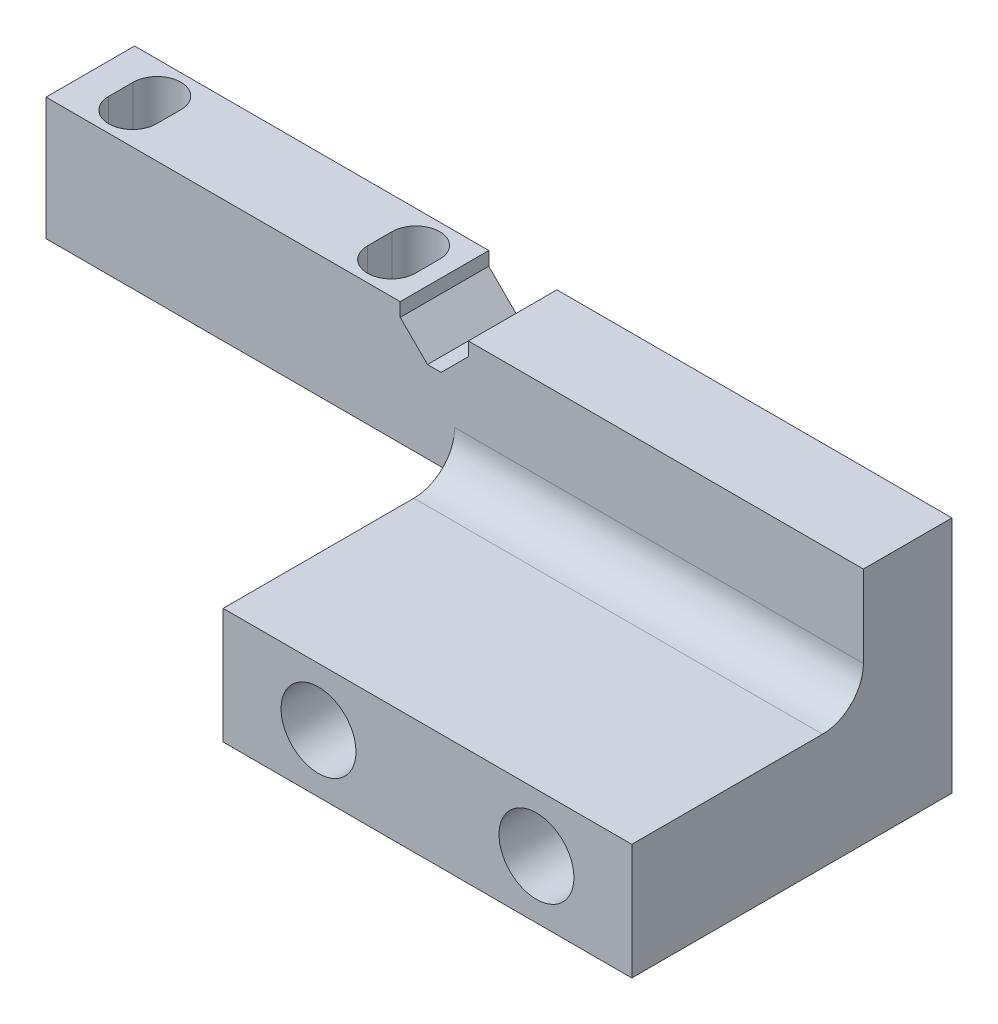
ISO-10303-21;
HEADER;
FILE_DESCRIPTION(('STEP AP214'),'2;1');
FILE_NAME('part.step','',(''),(''),'','','');
FILE_SCHEMA(('AUTOMOTIVE_DESIGN { 1 0 10303 214 1 1 1 1 }'));
ENDSEC;
DATA;
#1=APPLICATION_CONTEXT('core data for automotive mechanical design processes');
#2=APPLICATION_PROTOCOL_DEFINITION('international standard','automotive_design',2000,#1);
#3=PRODUCT_CONTEXT('',#1,'mechanical');
#4=PRODUCT('Part','Part','',(#3));
#5=PRODUCT_RELATED_PRODUCT_CATEGORY('part','',(#4));
#6=PRODUCT_DEFINITION_FORMATION('','',#4);
#7=PRODUCT_DEFINITION_CONTEXT('part definition',#1,'design');
#8=PRODUCT_DEFINITION('design','',#6,#7);
#9=PRODUCT_DEFINITION_SHAPE('','',#8);
#10=(LENGTH_UNIT() NAMED_UNIT(*) SI_UNIT(.MILLI.,.METRE.));
#11=(NAMED_UNIT(*) PLANE_ANGLE_UNIT() SI_UNIT($,.RADIAN.));
#12=(NAMED_UNIT(*) SI_UNIT($,.STERADIAN.) SOLID_ANGLE_UNIT());
#13=UNCERTAINTY_MEASURE_WITH_UNIT(LENGTH_MEASURE(1.E-05),#10,'distance_accuracy_value','');
#14=(GEOMETRIC_REPRESENTATION_CONTEXT(3) GLOBAL_UNCERTAINTY_ASSIGNED_CONTEXT((#13)) GLOBAL_UNIT_ASSIGNED_CONTEXT((#10,
#11,#12)) REPRESENTATION_CONTEXT('',''));
#15=CARTESIAN_POINT('',(0.,0.,0.));
#16=DIRECTION('',(0.,0.,1.));
#17=DIRECTION('',(1.,0.,0.));
#18=AXIS2_PLACEMENT_3D('',#15,#16,#17);
#19=CARTESIAN_POINT('',(-50.,13.25,0.));
#20=DIRECTION('',(0.,1.,0.));
#21=DIRECTION('',(1.,0.,0.));
#22=AXIS2_PLACEMENT_3D('',#19,#20,#21);
#23=PLANE('',#22);
#24=DIRECTION('',(0.,0.,-1.));
#25=VECTOR('',#24,1.);
#26=CARTESIAN_POINT('',(-69.,13.25,0.));
#27=LINE('',#26,#25);
#28=CARTESIAN_POINT('',(-69.,13.25,6.5));
#29=VERTEX_POINT('',#28);
#30=CARTESIAN_POINT('',(-69.,13.25,0.));
#31=VERTEX_POINT('',#30);
#32=EDGE_CURVE('E240',#29,#31,#27,.T.);
#33=ORIENTED_EDGE('',*,*,#32,.T.);
#34=DIRECTION('',(1.,0.,0.));
#35=VECTOR('',#34,1.);
#36=CARTESIAN_POINT('',(-5.,13.25,0.));
#37=LINE('',#36,#35);
#38=CARTESIAN_POINT('',(-95.,13.25,0.));
#39=VERTEX_POINT('',#38);
#40=EDGE_CURVE('E249',#39,#31,#37,.T.);
#41=ORIENTED_EDGE('',*,*,#40,.F.);
#42=DIRECTION('',(0.,0.,1.));
#43=VECTOR('',#42,1.);
#44=CARTESIAN_POINT('',(-95.,13.25,0.));
#45=LINE('',#44,#43);
#46=CARTESIAN_POINT('',(-95.,13.25,6.5));
#47=VERTEX_POINT('',#46);
#48=EDGE_CURVE('E382',#39,#47,#45,.T.);
#49=ORIENTED_EDGE('',*,*,#48,.T.);
#50=DIRECTION('',(-1.,0.,0.));
#51=VECTOR('',#50,1.);
#52=CARTESIAN_POINT('',(-5.,13.25,6.5));
#53=LINE('',#52,#51);
#54=EDGE_CURVE('E263',#29,#47,#53,.T.);
#55=ORIENTED_EDGE('',*,*,#54,.F.);
#56=EDGE_LOOP('',(#33,#41,#49,#55));
#57=FACE_BOUND('',#56,.T.);
#58=CARTESIAN_POINT('',(-72.,13.25,2.35));
#59=DIRECTION('',(0.,-1.,0.));
#60=DIRECTION('',(1.,0.,0.));
#61=AXIS2_PLACEMENT_3D('',#58,#59,#60);
#62=CIRCLE('',#61,1.75);
#63=CARTESIAN_POINT('',(-73.75,13.25,2.35));
#64=VERTEX_POINT('',#63);
#65=CARTESIAN_POINT('',(-70.25,13.25,2.35));
#66=VERTEX_POINT('',#65);
#67=EDGE_CURVE('E341',#64,#66,#62,.T.);
#68=ORIENTED_EDGE('',*,*,#67,.T.);
#69=DIRECTION('',(0.,0.,1.));
#70=VECTOR('',#69,1.);
#71=CARTESIAN_POINT('',(-70.25,13.25,2.35));
#72=LINE('',#71,#70);
#73=CARTESIAN_POINT('',(-70.25,13.25,4.15));
#74=VERTEX_POINT('',#73);
#75=EDGE_CURVE('E344',#66,#74,#72,.T.);
#76=ORIENTED_EDGE('',*,*,#75,.T.);
#77=CARTESIAN_POINT('',(-72.,13.25,4.15));
#78=DIRECTION('',(0.,-1.,0.));
#79=DIRECTION('',(1.,0.,0.));
#80=AXIS2_PLACEMENT_3D('',#77,#78,#79);
#81=CIRCLE('',#80,1.75);
#82=CARTESIAN_POINT('',(-73.75,13.25,4.15));
#83=VERTEX_POINT('',#82);
#84=EDGE_CURVE('E347',#74,#83,#81,.T.);
#85=ORIENTED_EDGE('',*,*,#84,.T.);
#86=DIRECTION('',(0.,0.,-1.));
#87=VECTOR('',#86,1.);
#88=CARTESIAN_POINT('',(-73.75,13.25,2.35));
#89=LINE('',#88,#87);
#90=EDGE_CURVE('E350',#83,#64,#89,.T.);
#91=ORIENTED_EDGE('',*,*,#90,.T.);
#92=EDGE_LOOP('',(#68,#76,#85,#91));
#93=FACE_BOUND('',#92,.T.);
#94=DIRECTION('',(0.,0.,-1.));
#95=VECTOR('',#94,1.);
#96=CARTESIAN_POINT('',(-89.25,13.25,2.35));
#97=LINE('',#96,#95);
#98=CARTESIAN_POINT('',(-89.25,13.25,4.15));
#99=VERTEX_POINT('',#98);
#100=CARTESIAN_POINT('',(-89.25,13.25,2.35));
#101=VERTEX_POINT('',#100);
#102=EDGE_CURVE('E364',#99,#101,#97,.T.);
#103=ORIENTED_EDGE('',*,*,#102,.F.);
#104=CARTESIAN_POINT('',(-91.,13.25,4.15));
#105=DIRECTION('',(0.,1.,0.));
#106=DIRECTION('',(-1.,0.,0.));
#107=AXIS2_PLACEMENT_3D('',#104,#105,#106);
#108=CIRCLE('',#107,1.75);
#109=CARTESIAN_POINT('',(-92.75,13.25,4.15));
#110=VERTEX_POINT('',#109);
#111=EDGE_CURVE('E367',#110,#99,#108,.T.);
#112=ORIENTED_EDGE('',*,*,#111,.F.);
#113=DIRECTION('',(0.,0.,1.));
#114=VECTOR('',#113,1.);
#115=CARTESIAN_POINT('',(-92.75,13.25,2.35));
#116=LINE('',#115,#114);
#117=CARTESIAN_POINT('',(-92.75,13.25,2.35));
#118=VERTEX_POINT('',#117);
#119=EDGE_CURVE('E370',#118,#110,#116,.T.);
#120=ORIENTED_EDGE('',*,*,#119,.F.);
#121=CARTESIAN_POINT('',(-91.,13.25,2.35));
#122=DIRECTION('',(0.,1.,0.));
#123=DIRECTION('',(-1.,0.,0.));
#124=AXIS2_PLACEMENT_3D('',#121,#122,#123);
#125=CIRCLE('',#124,1.75);
#126=EDGE_CURVE('E356',#101,#118,#125,.T.);
#127=ORIENTED_EDGE('',*,*,#126,.F.);
#128=EDGE_LOOP('',(#103,#112,#120,#127));
#129=FACE_BOUND('',#128,.T.);
#130=ADVANCED_FACE('F35',(#57,#93,#129),#23,.T.);
#131=CARTESIAN_POINT('',(-58.,0.,4.));
#132=DIRECTION('',(0.,0.,-1.));
#133=DIRECTION('',(1.,0.,0.));
#134=AXIS2_PLACEMENT_3D('',#131,#132,#133);
#135=CYLINDRICAL_SURFACE('',#134,4.5);
#136=CARTESIAN_POINT('',(-58.,0.,0.));
#137=DIRECTION('',(0.,0.,1.));
#138=DIRECTION('',(1.,0.,0.));
#139=AXIS2_PLACEMENT_3D('',#136,#137,#138);
#140=CIRCLE('',#139,4.5);
#141=CARTESIAN_POINT('',(-53.5,0.,0.));
#142=VERTEX_POINT('',#141);
#143=CARTESIAN_POINT('',(-62.5,0.,0.));
#144=VERTEX_POINT('',#143);
#145=EDGE_CURVE('E321',#142,#144,#140,.T.);
#146=ORIENTED_EDGE('',*,*,#145,.F.);
#147=DIRECTION('',(0.,0.,-1.));
#148=VECTOR('',#147,1.);
#149=CARTESIAN_POINT('',(-53.5,0.,4.));
#150=LINE('',#149,#148);
#151=CARTESIAN_POINT('',(-53.5,0.,4.));
#152=VERTEX_POINT('',#151);
#153=EDGE_CURVE('E292',#152,#142,#150,.T.);
#154=ORIENTED_EDGE('',*,*,#153,.F.);
#155=CARTESIAN_POINT('',(-58.,0.,4.));
#156=DIRECTION('',(0.,0.,1.));
#157=DIRECTION('',(1.,0.,0.));
#158=AXIS2_PLACEMENT_3D('',#155,#156,#157);
#159=CIRCLE('',#158,4.5);
#160=CARTESIAN_POINT('',(-62.5,0.,4.));
#161=VERTEX_POINT('',#160);
#162=EDGE_CURVE('E317',#152,#161,#159,.T.);
#163=ORIENTED_EDGE('',*,*,#162,.T.);
#164=DIRECTION('',(0.,0.,-1.));
#165=VECTOR('',#164,1.);
#166=CARTESIAN_POINT('',(-62.5,0.,4.));
#167=LINE('',#166,#165);
#168=EDGE_CURVE('E288',#161,#144,#167,.T.);
#169=ORIENTED_EDGE('',*,*,#168,.T.);
#170=EDGE_LOOP('',(#146,#154,#163,#169));
#171=FACE_BOUND('',#170,.T.);
#172=ADVANCED_FACE('F557',(#171),#135,.F.);
#173=CARTESIAN_POINT('',(-58.,0.,25.));
#174=DIRECTION('',(0.,0.,1.));
#175=DIRECTION('',(-1.,0.,0.));
#176=AXIS2_PLACEMENT_3D('',#173,#174,#175);
#177=CYLINDRICAL_SURFACE('',#176,2.74999999999999);
#178=CARTESIAN_POINT('',(-58.,0.,23.5));
#179=DIRECTION('',(0.,0.,1.));
#180=DIRECTION('',(1.,0.,0.));
#181=AXIS2_PLACEMENT_3D('',#178,#179,#180);
#182=CIRCLE('',#181,2.74999999999999);
#183=CARTESIAN_POINT('',(-55.25,0.,23.5));
#184=VERTEX_POINT('',#183);
#185=EDGE_CURVE('E409',#184,#184,#182,.F.);
#186=ORIENTED_EDGE('',*,*,#185,.F.);
#187=EDGE_LOOP('',(#186));
#188=FACE_BOUND('',#187,.T.);
#189=CARTESIAN_POINT('',(-58.,0.,4.));
#190=DIRECTION('',(0.,0.,1.));
#191=DIRECTION('',(1.,0.,0.));
#192=AXIS2_PLACEMENT_3D('',#189,#190,#191);
#193=CIRCLE('',#192,2.74999999999999);
#194=CARTESIAN_POINT('',(-55.25,0.,4.));
#195=VERTEX_POINT('',#194);
#196=EDGE_CURVE('E332',#195,#195,#193,.F.);
#197=ORIENTED_EDGE('',*,*,#196,.T.);
#198=EDGE_LOOP('',(#197));
#199=FACE_BOUND('',#198,.T.);
#200=ADVANCED_FACE('F585',(#188,#199),#177,.F.);
#201=CARTESIAN_POINT('',(-42.,0.,25.));
#202=DIRECTION('',(0.,0.,1.));
#203=DIRECTION('',(-1.,0.,0.));
#204=AXIS2_PLACEMENT_3D('',#201,#202,#203);
#205=CYLINDRICAL_SURFACE('',#204,2.74999999999999);
#206=CARTESIAN_POINT('',(-42.,0.,23.5));
#207=DIRECTION('',(0.,0.,1.));
#208=DIRECTION('',(1.,0.,0.));
#209=AXIS2_PLACEMENT_3D('',#206,#207,#208);
#210=CIRCLE('',#209,2.74999999999999);
#211=CARTESIAN_POINT('',(-39.25,0.,23.5));
#212=VERTEX_POINT('',#211);
#213=EDGE_CURVE('E406',#212,#212,#210,.F.);
#214=ORIENTED_EDGE('',*,*,#213,.F.);
#215=EDGE_LOOP('',(#214));
#216=FACE_BOUND('',#215,.T.);
#217=CARTESIAN_POINT('',(-42.,0.,4.));
#218=DIRECTION('',(0.,0.,1.));
#219=DIRECTION('',(1.,0.,0.));
#220=AXIS2_PLACEMENT_3D('',#217,#218,#219);
#221=CIRCLE('',#220,2.74999999999999);
#222=CARTESIAN_POINT('',(-39.25,0.,4.));
#223=VERTEX_POINT('',#222);
#224=EDGE_CURVE('E320',#223,#223,#221,.F.);
#225=ORIENTED_EDGE('',*,*,#224,.T.);
#226=EDGE_LOOP('',(#225));
#227=FACE_BOUND('',#226,.T.);
#228=ADVANCED_FACE('F590',(#216,#227),#205,.F.);
#229=DIRECTION('',(0.,0.,1.));
#230=VECTOR('',#229,1.);
#231=CARTESIAN_POINT('',(-64.,13.25,0.));
#232=LINE('',#231,#230);
#233=CARTESIAN_POINT('',(-64.,13.25,0.));
#234=VERTEX_POINT('',#233);
#235=CARTESIAN_POINT('',(-64.,13.25,6.5));
#236=VERTEX_POINT('',#235);
#237=EDGE_CURVE('E264',#234,#236,#232,.T.);
#238=ORIENTED_EDGE('',*,*,#237,.T.);
#239=CARTESIAN_POINT('',(-35.,13.25,6.5));
#240=VERTEX_POINT('',#239);
#241=EDGE_CURVE('E414',#240,#236,#53,.T.);
#242=ORIENTED_EDGE('',*,*,#241,.F.);
#243=DIRECTION('',(0.,0.,1.));
#244=VECTOR('',#243,1.);
#245=CARTESIAN_POINT('',(-35.,13.25,-3.5));
#246=LINE('',#245,#244);
#247=CARTESIAN_POINT('',(-35.,13.25,0.));
#248=VERTEX_POINT('',#247);
#249=EDGE_CURVE('E338',#248,#240,#246,.T.);
#250=ORIENTED_EDGE('',*,*,#249,.F.);
#251=EDGE_CURVE('E258',#234,#248,#37,.T.);
#252=ORIENTED_EDGE('',*,*,#251,.F.);
#253=EDGE_LOOP('',(#238,#242,#250,#252));
#254=FACE_BOUND('',#253,.T.);
#255=ADVANCED_FACE('F500',(#254),#23,.T.);
#256=CARTESIAN_POINT('',(-50.,4.25000000000001,0.));
#257=DIRECTION('',(0.,1.,0.));
#258=DIRECTION('',(-1.,0.,0.));
#259=AXIS2_PLACEMENT_3D('',#256,#257,#258);
#260=PLANE('',#259);
#261=DIRECTION('',(0.,0.,-1.));
#262=VECTOR('',#261,1.);
#263=CARTESIAN_POINT('',(-73.75,4.25000000000002,0.));
#264=LINE('',#263,#262);
#265=CARTESIAN_POINT('',(-73.75,4.25000000000002,4.15));
#266=VERTEX_POINT('',#265);
#267=CARTESIAN_POINT('',(-73.75,4.25000000000002,2.35));
#268=VERTEX_POINT('',#267);
#269=EDGE_CURVE('E468',#266,#268,#264,.T.);
#270=ORIENTED_EDGE('',*,*,#269,.F.);
#271=CARTESIAN_POINT('',(-72.,4.25000000000002,4.15));
#272=DIRECTION('',(0.,-1.,0.));
#273=DIRECTION('',(1.,0.,0.));
#274=AXIS2_PLACEMENT_3D('',#271,#272,#273);
#275=CIRCLE('',#274,1.75);
#276=CARTESIAN_POINT('',(-70.25,4.25000000000002,4.15));
#277=VERTEX_POINT('',#276);
#278=EDGE_CURVE('E465',#277,#266,#275,.T.);
#279=ORIENTED_EDGE('',*,*,#278,.F.);
#280=DIRECTION('',(0.,0.,1.));
#281=VECTOR('',#280,1.);
#282=CARTESIAN_POINT('',(-70.25,4.25000000000002,0.));
#283=LINE('',#282,#281);
#284=CARTESIAN_POINT('',(-70.25,4.25000000000002,2.35));
#285=VERTEX_POINT('',#284);
#286=EDGE_CURVE('E462',#285,#277,#283,.T.);
#287=ORIENTED_EDGE('',*,*,#286,.F.);
#288=CARTESIAN_POINT('',(-72.,4.25000000000002,2.35));
#289=DIRECTION('',(0.,-1.,0.));
#290=DIRECTION('',(1.,0.,0.));
#291=AXIS2_PLACEMENT_3D('',#288,#289,#290);
#292=CIRCLE('',#291,1.75);
#293=EDGE_CURVE('E471',#268,#285,#292,.T.);
#294=ORIENTED_EDGE('',*,*,#293,.F.);
#295=EDGE_LOOP('',(#270,#279,#287,#294));
#296=FACE_BOUND('',#295,.T.);
#297=DIRECTION('',(1.,0.,0.));
#298=VECTOR('',#297,1.);
#299=CARTESIAN_POINT('',(-95.,4.25000000000003,6.5));
#300=LINE('',#299,#298);
#301=CARTESIAN_POINT('',(-95.,4.25000000000003,6.5));
#302=VERTEX_POINT('',#301);
#303=CARTESIAN_POINT('',(-65.,4.25000000000002,6.5));
#304=VERTEX_POINT('',#303);
#305=EDGE_CURVE('E385',#302,#304,#300,.T.);
#306=ORIENTED_EDGE('',*,*,#305,.F.);
#307=DIRECTION('',(0.,0.,1.));
#308=VECTOR('',#307,1.);
#309=CARTESIAN_POINT('',(-95.,4.25000000000003,0.));
#310=LINE('',#309,#308);
#311=CARTESIAN_POINT('',(-95.,4.25000000000003,0.));
#312=VERTEX_POINT('',#311);
#313=EDGE_CURVE('E376',#312,#302,#310,.T.);
#314=ORIENTED_EDGE('',*,*,#313,.F.);
#315=DIRECTION('',(-1.,0.,0.));
#316=VECTOR('',#315,1.);
#317=CARTESIAN_POINT('',(-95.,4.25000000000003,0.));
#318=LINE('',#317,#316);
#319=CARTESIAN_POINT('',(-65.,4.25000000000002,0.));
#320=VERTEX_POINT('',#319);
#321=EDGE_CURVE('E388',#320,#312,#318,.T.);
#322=ORIENTED_EDGE('',*,*,#321,.F.);
#323=DIRECTION('',(0.,0.,-1.));
#324=VECTOR('',#323,1.);
#325=CARTESIAN_POINT('',(-65.,4.25000000000002,25.));
#326=LINE('',#325,#324);
#327=EDGE_CURVE('E397',#304,#320,#326,.T.);
#328=ORIENTED_EDGE('',*,*,#327,.F.);
#329=EDGE_LOOP('',(#306,#314,#322,#328));
#330=FACE_BOUND('',#329,.T.);
#331=CARTESIAN_POINT('',(-91.,4.25000000000003,2.35));
#332=DIRECTION('',(0.,-1.,0.));
#333=DIRECTION('',(1.,0.,0.));
#334=AXIS2_PLACEMENT_3D('',#331,#332,#333);
#335=CIRCLE('',#334,1.75);
#336=CARTESIAN_POINT('',(-89.25,4.25000000000003,2.35));
#337=VERTEX_POINT('',#336);
#338=CARTESIAN_POINT('',(-92.75,4.25000000000003,2.35));
#339=VERTEX_POINT('',#338);
#340=EDGE_CURVE('E459',#337,#339,#335,.F.);
#341=ORIENTED_EDGE('',*,*,#340,.T.);
#342=DIRECTION('',(0.,0.,1.));
#343=VECTOR('',#342,1.);
#344=CARTESIAN_POINT('',(-92.75,4.25000000000003,0.));
#345=LINE('',#344,#343);
#346=CARTESIAN_POINT('',(-92.75,4.25000000000003,4.15));
#347=VERTEX_POINT('',#346);
#348=EDGE_CURVE('E456',#339,#347,#345,.T.);
#349=ORIENTED_EDGE('',*,*,#348,.T.);
#350=CARTESIAN_POINT('',(-91.,4.25000000000003,4.15));
#351=DIRECTION('',(0.,-1.,0.));
#352=DIRECTION('',(1.,0.,0.));
#353=AXIS2_PLACEMENT_3D('',#350,#351,#352);
#354=CIRCLE('',#353,1.75);
#355=CARTESIAN_POINT('',(-89.25,4.25000000000003,4.15));
#356=VERTEX_POINT('',#355);
#357=EDGE_CURVE('E453',#347,#356,#354,.F.);
#358=ORIENTED_EDGE('',*,*,#357,.T.);
#359=DIRECTION('',(0.,0.,-1.));
#360=VECTOR('',#359,1.);
#361=CARTESIAN_POINT('',(-89.25,4.25000000000003,0.));
#362=LINE('',#361,#360);
#363=EDGE_CURVE('E448',#356,#337,#362,.T.);
#364=ORIENTED_EDGE('',*,*,#363,.T.);
#365=EDGE_LOOP('',(#341,#349,#358,#364));
#366=FACE_BOUND('',#365,.T.);
#367=ADVANCED_FACE('F516',(#296,#330,#366),#260,.F.);
#368=CARTESIAN_POINT('',(-65.,4.25000000000002,25.));
#369=DIRECTION('',(0.,-1.,0.));
#370=DIRECTION('',(-1.,0.,0.));
#371=AXIS2_PLACEMENT_3D('',#368,#369,#370);
#372=PLANE('',#371);
#373=DIRECTION('',(0.,0.,-1.));
#374=VECTOR('',#373,1.);
#375=CARTESIAN_POINT('',(-35.,4.25,25.));
#376=LINE('',#375,#374);
#377=CARTESIAN_POINT('',(-35.,4.25000000000001,23.5));
#378=VERTEX_POINT('',#377);
#379=CARTESIAN_POINT('',(-35.,4.25,9.5));
#380=VERTEX_POINT('',#379);
#381=EDGE_CURVE('E426',#378,#380,#376,.T.);
#382=ORIENTED_EDGE('',*,*,#381,.T.);
#383=DIRECTION('',(-1.,0.,0.));
#384=VECTOR('',#383,1.);
#385=CARTESIAN_POINT('',(-35.,4.25,9.5));
#386=LINE('',#385,#384);
#387=CARTESIAN_POINT('',(-65.,4.25000000000002,9.5));
#388=VERTEX_POINT('',#387);
#389=EDGE_CURVE('E440',#388,#380,#386,.F.);
#390=ORIENTED_EDGE('',*,*,#389,.F.);
#391=DIRECTION('',(0.,0.,-1.));
#392=VECTOR('',#391,1.);
#393=CARTESIAN_POINT('',(-65.,4.25000000000002,25.));
#394=LINE('',#393,#392);
#395=CARTESIAN_POINT('',(-65.,4.25000000000002,23.5));
#396=VERTEX_POINT('',#395);
#397=EDGE_CURVE('E429',#396,#388,#394,.T.);
#398=ORIENTED_EDGE('',*,*,#397,.F.);
#399=DIRECTION('',(-1.,0.,0.));
#400=VECTOR('',#399,1.);
#401=CARTESIAN_POINT('',(-5.00000000000001,4.24999999999999,23.5));
#402=LINE('',#401,#400);
#403=EDGE_CURVE('E403',#378,#396,#402,.T.);
#404=ORIENTED_EDGE('',*,*,#403,.F.);
#405=EDGE_LOOP('',(#382,#390,#398,#404));
#406=FACE_BOUND('',#405,.T.);
#407=ADVANCED_FACE('F568',(#406),#372,.F.);
#408=CARTESIAN_POINT('',(-35.,-4.25,25.));
#409=DIRECTION('',(-1.,0.,0.));
#410=DIRECTION('',(0.,1.,0.));
#411=AXIS2_PLACEMENT_3D('',#408,#409,#410);
#412=PLANE('',#411);
#413=ORIENTED_EDGE('',*,*,#249,.T.);
#414=DIRECTION('',(0.,1.,0.));
#415=VECTOR('',#414,1.);
#416=CARTESIAN_POINT('',(-35.,4.25000000000001,6.5));
#417=LINE('',#416,#415);
#418=CARTESIAN_POINT('',(-35.,7.25,6.5));
#419=VERTEX_POINT('',#418);
#420=EDGE_CURVE('E336',#419,#240,#417,.T.);
#421=ORIENTED_EDGE('',*,*,#420,.F.);
#422=CARTESIAN_POINT('',(-35.,7.25,9.5));
#423=DIRECTION('',(1.,0.,0.));
#424=DIRECTION('',(0.,1.,0.));
#425=AXIS2_PLACEMENT_3D('',#422,#423,#424);
#426=CIRCLE('',#425,3.);
#427=EDGE_CURVE('E445',#380,#419,#426,.T.);
#428=ORIENTED_EDGE('',*,*,#427,.F.);
#429=ORIENTED_EDGE('',*,*,#381,.F.);
#430=DIRECTION('',(0.,1.,0.));
#431=VECTOR('',#430,1.);
#432=CARTESIAN_POINT('',(-35.,-4.25,23.5));
#433=LINE('',#432,#431);
#434=CARTESIAN_POINT('',(-35.,-4.24999999999999,23.5));
#435=VERTEX_POINT('',#434);
#436=EDGE_CURVE('E412',#435,#378,#433,.T.);
#437=ORIENTED_EDGE('',*,*,#436,.F.);
#438=DIRECTION('',(0.,0.,-1.));
#439=VECTOR('',#438,1.);
#440=CARTESIAN_POINT('',(-35.,-4.25,25.));
#441=LINE('',#440,#439);
#442=CARTESIAN_POINT('',(-35.,-4.25,0.));
#443=VERTEX_POINT('',#442);
#444=EDGE_CURVE('E435',#435,#443,#441,.T.);
#445=ORIENTED_EDGE('',*,*,#444,.T.);
#446=DIRECTION('',(0.,-1.,0.));
#447=VECTOR('',#446,1.);
#448=CARTESIAN_POINT('',(-35.,-4.25,0.));
#449=LINE('',#448,#447);
#450=EDGE_CURVE('E257',#248,#443,#449,.T.);
#451=ORIENTED_EDGE('',*,*,#450,.F.);
#452=EDGE_LOOP('',(#413,#421,#428,#429,#437,#445,#451));
#453=FACE_BOUND('',#452,.T.);
#454=ADVANCED_FACE('F528',(#453),#412,.F.);
#455=CARTESIAN_POINT('',(-65.,-4.24999999999998,25.));
#456=DIRECTION('',(0.,1.,0.));
#457=DIRECTION('',(1.,0.,0.));
#458=AXIS2_PLACEMENT_3D('',#455,#456,#457);
#459=PLANE('',#458);
#460=DIRECTION('',(1.,0.,0.));
#461=VECTOR('',#460,1.);
#462=CARTESIAN_POINT('',(-65.,-4.24999999999998,4.));
#463=LINE('',#462,#461);
#464=CARTESIAN_POINT('',(-62.5,-4.24999999999998,4.));
#465=VERTEX_POINT('',#464);
#466=CARTESIAN_POINT('',(-53.5,-4.24999999999999,4.));
#467=VERTEX_POINT('',#466);
#468=EDGE_CURVE('E333',#465,#467,#463,.T.);
#469=ORIENTED_EDGE('',*,*,#468,.T.);
#470=DIRECTION('',(0.,0.,-1.));
#471=VECTOR('',#470,1.);
#472=CARTESIAN_POINT('',(-53.5,-4.24999999999999,4.));
#473=LINE('',#472,#471);
#474=CARTESIAN_POINT('',(-53.5,-4.24999999999999,0.));
#475=VERTEX_POINT('',#474);
#476=EDGE_CURVE('E295',#467,#475,#473,.T.);
#477=ORIENTED_EDGE('',*,*,#476,.T.);
#478=DIRECTION('',(-1.,0.,0.));
#479=VECTOR('',#478,1.);
#480=CARTESIAN_POINT('',(-65.,-4.24999999999998,0.));
#481=LINE('',#480,#479);
#482=CARTESIAN_POINT('',(-46.5,-4.24999999999999,0.));
#483=VERTEX_POINT('',#482);
#484=EDGE_CURVE('E424',#483,#475,#481,.T.);
#485=ORIENTED_EDGE('',*,*,#484,.F.);
#486=DIRECTION('',(0.,0.,-1.));
#487=VECTOR('',#486,1.);
#488=CARTESIAN_POINT('',(-46.5,-4.24999999999999,4.));
#489=LINE('',#488,#487);
#490=CARTESIAN_POINT('',(-46.5,-4.24999999999999,4.));
#491=VERTEX_POINT('',#490);
#492=EDGE_CURVE('E311',#491,#483,#489,.T.);
#493=ORIENTED_EDGE('',*,*,#492,.F.);
#494=DIRECTION('',(1.,0.,0.));
#495=VECTOR('',#494,1.);
#496=CARTESIAN_POINT('',(-65.,-4.24999999999998,4.));
#497=LINE('',#496,#495);
#498=CARTESIAN_POINT('',(-37.5,-4.24999999999999,4.));
#499=VERTEX_POINT('',#498);
#500=EDGE_CURVE('E329',#491,#499,#497,.T.);
#501=ORIENTED_EDGE('',*,*,#500,.T.);
#502=DIRECTION('',(0.,0.,-1.));
#503=VECTOR('',#502,1.);
#504=CARTESIAN_POINT('',(-37.5,-4.24999999999999,4.));
#505=LINE('',#504,#503);
#506=CARTESIAN_POINT('',(-37.5,-4.24999999999999,0.));
#507=VERTEX_POINT('',#506);
#508=EDGE_CURVE('E286',#499,#507,#505,.T.);
#509=ORIENTED_EDGE('',*,*,#508,.T.);
#510=EDGE_CURVE('E420',#443,#507,#481,.T.);
#511=ORIENTED_EDGE('',*,*,#510,.F.);
#512=ORIENTED_EDGE('',*,*,#444,.F.);
#513=DIRECTION('',(-1.,0.,0.));
#514=VECTOR('',#513,1.);
#515=CARTESIAN_POINT('',(-5.00000000000001,-4.25000000000001,23.5));
#516=LINE('',#515,#514);
#517=CARTESIAN_POINT('',(-65.,-4.24999999999998,23.5));
#518=VERTEX_POINT('',#517);
#519=EDGE_CURVE('E402',#435,#518,#516,.T.);
#520=ORIENTED_EDGE('',*,*,#519,.T.);
#521=DIRECTION('',(0.,0.,-1.));
#522=VECTOR('',#521,1.);
#523=CARTESIAN_POINT('',(-65.,-4.24999999999998,25.));
#524=LINE('',#523,#522);
#525=CARTESIAN_POINT('',(-65.,-4.24999999999998,0.));
#526=VERTEX_POINT('',#525);
#527=EDGE_CURVE('E432',#518,#526,#524,.T.);
#528=ORIENTED_EDGE('',*,*,#527,.T.);
#529=CARTESIAN_POINT('',(-62.5,-4.24999999999998,0.));
#530=VERTEX_POINT('',#529);
#531=EDGE_CURVE('E419',#530,#526,#481,.T.);
#532=ORIENTED_EDGE('',*,*,#531,.F.);
#533=DIRECTION('',(0.,0.,-1.));
#534=VECTOR('',#533,1.);
#535=CARTESIAN_POINT('',(-62.5,-4.24999999999998,4.));
#536=LINE('',#535,#534);
#537=EDGE_CURVE('E283',#465,#530,#536,.T.);
#538=ORIENTED_EDGE('',*,*,#537,.F.);
#539=EDGE_LOOP('',(#469,#477,#485,#493,#501,#509,#511,#512,#520,#528,#532,#538));
#540=FACE_BOUND('',#539,.T.);
#541=ADVANCED_FACE('F532',(#540),#459,.F.);
#542=CARTESIAN_POINT('',(-65.,-4.24999999999998,25.));
#543=DIRECTION('',(1.,0.,0.));
#544=DIRECTION('',(0.,0.,1.));
#545=AXIS2_PLACEMENT_3D('',#542,#543,#544);
#546=PLANE('',#545);
#547=ORIENTED_EDGE('',*,*,#327,.T.);
#548=DIRECTION('',(0.,1.,0.));
#549=VECTOR('',#548,1.);
#550=CARTESIAN_POINT('',(-65.,-4.24999999999998,0.));
#551=LINE('',#550,#549);
#552=EDGE_CURVE('E423',#526,#320,#551,.T.);
#553=ORIENTED_EDGE('',*,*,#552,.F.);
#554=ORIENTED_EDGE('',*,*,#527,.F.);
#555=DIRECTION('',(0.,1.,0.));
#556=VECTOR('',#555,1.);
#557=CARTESIAN_POINT('',(-65.,4.25000000000002,23.5));
#558=LINE('',#557,#556);
#559=EDGE_CURVE('E400',#518,#396,#558,.T.);
#560=ORIENTED_EDGE('',*,*,#559,.T.);
#561=ORIENTED_EDGE('',*,*,#397,.T.);
#562=CARTESIAN_POINT('',(-65.,7.25000000000002,9.5));
#563=DIRECTION('',(-1.,0.,0.));
#564=DIRECTION('',(0.,0.,1.));
#565=AXIS2_PLACEMENT_3D('',#562,#563,#564);
#566=CIRCLE('',#565,3.);
#567=CARTESIAN_POINT('',(-65.,7.25000000000002,6.5));
#568=VERTEX_POINT('',#567);
#569=EDGE_CURVE('E443',#568,#388,#566,.T.);
#570=ORIENTED_EDGE('',*,*,#569,.F.);
#571=DIRECTION('',(0.,1.,0.));
#572=VECTOR('',#571,1.);
#573=CARTESIAN_POINT('',(-65.,-4.24999999999998,6.5));
#574=LINE('',#573,#572);
#575=EDGE_CURVE('E394',#304,#568,#574,.T.);
#576=ORIENTED_EDGE('',*,*,#575,.F.);
#577=EDGE_LOOP('',(#547,#553,#554,#560,#561,#570,#576));
#578=FACE_BOUND('',#577,.T.);
#579=ADVANCED_FACE('F520',(#578),#546,.F.);
#580=CARTESIAN_POINT('',(-50.,0.,0.));
#581=DIRECTION('',(0.,0.,1.));
#582=DIRECTION('',(-1.,0.,0.));
#583=AXIS2_PLACEMENT_3D('',#580,#581,#582);
#584=PLANE('',#583);
#585=DIRECTION('',(1.,0.,0.));
#586=VECTOR('',#585,1.);
#587=CARTESIAN_POINT('',(-69.,10.25,0.));
#588=LINE('',#587,#586);
#589=CARTESIAN_POINT('',(-67.,10.25,0.));
#590=VERTEX_POINT('',#589);
#591=CARTESIAN_POINT('',(-66.,10.25,0.));
#592=VERTEX_POINT('',#591);
#593=EDGE_CURVE('E267',#590,#592,#588,.T.);
#594=ORIENTED_EDGE('',*,*,#593,.T.);
#595=DIRECTION('',(0.707106781186552,0.707106781186543,0.));
#596=VECTOR('',#595,1.);
#597=CARTESIAN_POINT('',(-63.1249999999999,13.1250000000001,0.));
#598=LINE('',#597,#596);
#599=CARTESIAN_POINT('',(-64.,12.25,0.));
#600=VERTEX_POINT('',#599);
#601=EDGE_CURVE('E11',#600,#592,#598,.F.);
#602=ORIENTED_EDGE('',*,*,#601,.F.);
#603=DIRECTION('',(0.,1.,0.));
#604=VECTOR('',#603,1.);
#605=CARTESIAN_POINT('',(-64.,10.25,0.));
#606=LINE('',#605,#604);
#607=EDGE_CURVE('E245',#600,#234,#606,.T.);
#608=ORIENTED_EDGE('',*,*,#607,.T.);
#609=ORIENTED_EDGE('',*,*,#251,.T.);
#610=ORIENTED_EDGE('',*,*,#450,.T.);
#611=ORIENTED_EDGE('',*,*,#510,.T.);
#612=DIRECTION('',(0.,1.,0.));
#613=VECTOR('',#612,1.);
#614=CARTESIAN_POINT('',(-37.5,0.,0.));
#615=LINE('',#614,#613);
#616=CARTESIAN_POINT('',(-37.5,0.,0.));
#617=VERTEX_POINT('',#616);
#618=EDGE_CURVE('E274',#507,#617,#615,.T.);
#619=ORIENTED_EDGE('',*,*,#618,.T.);
#620=CARTESIAN_POINT('',(-42.,0.,0.));
#621=DIRECTION('',(0.,0.,1.));
#622=DIRECTION('',(1.,0.,0.));
#623=AXIS2_PLACEMENT_3D('',#620,#621,#622);
#624=CIRCLE('',#623,4.5);
#625=CARTESIAN_POINT('',(-46.5,0.,0.));
#626=VERTEX_POINT('',#625);
#627=EDGE_CURVE('E291',#617,#626,#624,.T.);
#628=ORIENTED_EDGE('',*,*,#627,.T.);
#629=DIRECTION('',(0.,-1.,0.));
#630=VECTOR('',#629,1.);
#631=CARTESIAN_POINT('',(-46.5,0.,0.));
#632=LINE('',#631,#630);
#633=EDGE_CURVE('E303',#626,#483,#632,.T.);
#634=ORIENTED_EDGE('',*,*,#633,.T.);
#635=ORIENTED_EDGE('',*,*,#484,.T.);
#636=DIRECTION('',(0.,1.,0.));
#637=VECTOR('',#636,1.);
#638=CARTESIAN_POINT('',(-53.5,0.,0.));
#639=LINE('',#638,#637);
#640=EDGE_CURVE('E281',#475,#142,#639,.T.);
#641=ORIENTED_EDGE('',*,*,#640,.T.);
#642=ORIENTED_EDGE('',*,*,#145,.T.);
#643=DIRECTION('',(0.,-1.,0.));
#644=VECTOR('',#643,1.);
#645=CARTESIAN_POINT('',(-62.5,0.,0.));
#646=LINE('',#645,#644);
#647=EDGE_CURVE('E284',#144,#530,#646,.T.);
#648=ORIENTED_EDGE('',*,*,#647,.T.);
#649=ORIENTED_EDGE('',*,*,#531,.T.);
#650=ORIENTED_EDGE('',*,*,#552,.T.);
#651=ORIENTED_EDGE('',*,*,#321,.T.);
#652=DIRECTION('',(0.,-1.,0.));
#653=VECTOR('',#652,1.);
#654=CARTESIAN_POINT('',(-95.,13.25,0.));
#655=LINE('',#654,#653);
#656=EDGE_CURVE('E253',#39,#312,#655,.T.);
#657=ORIENTED_EDGE('',*,*,#656,.F.);
#658=ORIENTED_EDGE('',*,*,#40,.T.);
#659=DIRECTION('',(0.,1.,0.));
#660=VECTOR('',#659,1.);
#661=CARTESIAN_POINT('',(-69.,10.25,0.));
#662=LINE('',#661,#660);
#663=CARTESIAN_POINT('',(-69.,12.25,0.));
#664=VERTEX_POINT('',#663);
#665=EDGE_CURVE('E235',#664,#31,#662,.T.);
#666=ORIENTED_EDGE('',*,*,#665,.F.);
#667=DIRECTION('',(0.707106781186552,-0.707106781186543,0.));
#668=VECTOR('',#667,1.);
#669=CARTESIAN_POINT('',(-53.3749999999999,-3.37499999999991,0.));
#670=LINE('',#669,#668);
#671=EDGE_CURVE('E484',#590,#664,#670,.F.);
#672=ORIENTED_EDGE('',*,*,#671,.F.);
#673=EDGE_LOOP('',(#594,#602,#608,#609,#610,#611,#619,#628,#634,#635,#641,#642,#648,#649,#650,
#651,#657,#658,#666,#672));
#674=FACE_BOUND('',#673,.T.);
#675=ADVANCED_FACE('F251',(#674),#584,.F.);
#676=CARTESIAN_POINT('',(-5.,13.25,6.5));
#677=DIRECTION('',(0.,0.,-1.));
#678=DIRECTION('',(1.,0.,0.));
#679=AXIS2_PLACEMENT_3D('',#676,#677,#678);
#680=PLANE('',#679);
#681=ORIENTED_EDGE('',*,*,#54,.T.);
#682=DIRECTION('',(0.,-1.,0.));
#683=VECTOR('',#682,1.);
#684=CARTESIAN_POINT('',(-95.,13.25,6.5));
#685=LINE('',#684,#683);
#686=EDGE_CURVE('E384',#47,#302,#685,.T.);
#687=ORIENTED_EDGE('',*,*,#686,.T.);
#688=ORIENTED_EDGE('',*,*,#305,.T.);
#689=ORIENTED_EDGE('',*,*,#575,.T.);
#690=DIRECTION('',(-1.,0.,0.));
#691=VECTOR('',#690,1.);
#692=CARTESIAN_POINT('',(-65.,7.25000000000002,6.5));
#693=LINE('',#692,#691);
#694=EDGE_CURVE('E438',#419,#568,#693,.T.);
#695=ORIENTED_EDGE('',*,*,#694,.F.);
#696=ORIENTED_EDGE('',*,*,#420,.T.);
#697=ORIENTED_EDGE('',*,*,#241,.T.);
#698=DIRECTION('',(0.,1.,0.));
#699=VECTOR('',#698,1.);
#700=CARTESIAN_POINT('',(-64.,10.25,6.5));
#701=LINE('',#700,#699);
#702=CARTESIAN_POINT('',(-64.,12.25,6.5));
#703=VERTEX_POINT('',#702);
#704=EDGE_CURVE('E275',#703,#236,#701,.T.);
#705=ORIENTED_EDGE('',*,*,#704,.F.);
#706=DIRECTION('',(-0.707106781186552,-0.707106781186543,0.));
#707=VECTOR('',#706,1.);
#708=CARTESIAN_POINT('',(-33.9999999999997,42.25,6.5));
#709=LINE('',#708,#707);
#710=CARTESIAN_POINT('',(-66.,10.25,6.5));
#711=VERTEX_POINT('',#710);
#712=EDGE_CURVE('E43',#711,#703,#709,.F.);
#713=ORIENTED_EDGE('',*,*,#712,.F.);
#714=DIRECTION('',(-1.,0.,0.));
#715=VECTOR('',#714,1.);
#716=CARTESIAN_POINT('',(-69.,10.25,6.5));
#717=LINE('',#716,#715);
#718=CARTESIAN_POINT('',(-67.,10.25,6.5));
#719=VERTEX_POINT('',#718);
#720=EDGE_CURVE('E246',#711,#719,#717,.T.);
#721=ORIENTED_EDGE('',*,*,#720,.T.);
#722=DIRECTION('',(-0.707106781186552,0.707106781186543,0.));
#723=VECTOR('',#722,1.);
#724=CARTESIAN_POINT('',(-37.4999999999996,-19.25,6.5));
#725=LINE('',#724,#723);
#726=CARTESIAN_POINT('',(-69.,12.25,6.5));
#727=VERTEX_POINT('',#726);
#728=EDGE_CURVE('E486',#727,#719,#725,.F.);
#729=ORIENTED_EDGE('',*,*,#728,.F.);
#730=DIRECTION('',(0.,1.,0.));
#731=VECTOR('',#730,1.);
#732=CARTESIAN_POINT('',(-69.,10.25,6.5));
#733=LINE('',#732,#731);
#734=EDGE_CURVE('E272',#727,#29,#733,.T.);
#735=ORIENTED_EDGE('',*,*,#734,.T.);
#736=EDGE_LOOP('',(#681,#687,#688,#689,#695,#696,#697,#705,#713,#721,#729,#735));
#737=FACE_BOUND('',#736,.T.);
#738=ADVANCED_FACE('F493',(#737),#680,.F.);
#739=CARTESIAN_POINT('',(-5.00000000000001,7.24999999999999,9.5));
#740=DIRECTION('',(1.,0.,0.));
#741=DIRECTION('',(0.,-1.,0.));
#742=AXIS2_PLACEMENT_3D('',#739,#740,#741);
#743=CYLINDRICAL_SURFACE('',#742,3.);
#744=ORIENTED_EDGE('',*,*,#427,.T.);
#745=ORIENTED_EDGE('',*,*,#694,.T.);
#746=ORIENTED_EDGE('',*,*,#569,.T.);
#747=ORIENTED_EDGE('',*,*,#389,.T.);
#748=EDGE_LOOP('',(#744,#745,#746,#747));
#749=FACE_BOUND('',#748,.T.);
#750=ADVANCED_FACE('F524',(#749),#743,.F.);
#751=CARTESIAN_POINT('',(-5.00000000000001,4.24999999999999,23.5));
#752=DIRECTION('',(0.,0.,-1.));
#753=DIRECTION('',(1.,0.,0.));
#754=AXIS2_PLACEMENT_3D('',#751,#752,#753);
#755=PLANE('',#754);
#756=ORIENTED_EDGE('',*,*,#213,.T.);
#757=EDGE_LOOP('',(#756));
#758=FACE_BOUND('',#757,.T.);
#759=ORIENTED_EDGE('',*,*,#185,.T.);
#760=EDGE_LOOP('',(#759));
#761=FACE_BOUND('',#760,.T.);
#762=ORIENTED_EDGE('',*,*,#519,.F.);
#763=ORIENTED_EDGE('',*,*,#436,.T.);
#764=ORIENTED_EDGE('',*,*,#403,.T.);
#765=ORIENTED_EDGE('',*,*,#559,.F.);
#766=EDGE_LOOP('',(#762,#763,#764,#765));
#767=FACE_BOUND('',#766,.T.);
#768=ADVANCED_FACE('F566',(#758,#761,#767),#755,.F.);
#769=CARTESIAN_POINT('',(-95.,13.25,0.));
#770=DIRECTION('',(-1.,0.,0.));
#771=DIRECTION('',(0.,1.,0.));
#772=AXIS2_PLACEMENT_3D('',#769,#770,#771);
#773=PLANE('',#772);
#774=ORIENTED_EDGE('',*,*,#313,.T.);
#775=ORIENTED_EDGE('',*,*,#686,.F.);
#776=ORIENTED_EDGE('',*,*,#48,.F.);
#777=ORIENTED_EDGE('',*,*,#656,.T.);
#778=EDGE_LOOP('',(#774,#775,#776,#777));
#779=FACE_BOUND('',#778,.T.);
#780=ADVANCED_FACE('F510',(#779),#773,.T.);
#781=CARTESIAN_POINT('',(-91.,-4.24999999999998,2.35));
#782=DIRECTION('',(0.,1.,0.));
#783=DIRECTION('',(1.,0.,0.));
#784=AXIS2_PLACEMENT_3D('',#781,#782,#783);
#785=CYLINDRICAL_SURFACE('',#784,1.75);
#786=ORIENTED_EDGE('',*,*,#340,.F.);
#787=DIRECTION('',(0.,1.,0.));
#788=VECTOR('',#787,1.);
#789=CARTESIAN_POINT('',(-89.25,-4.24999999999998,2.35));
#790=LINE('',#789,#788);
#791=EDGE_CURVE('E373',#337,#101,#790,.T.);
#792=ORIENTED_EDGE('',*,*,#791,.T.);
#793=ORIENTED_EDGE('',*,*,#126,.T.);
#794=DIRECTION('',(0.,1.,0.));
#795=VECTOR('',#794,1.);
#796=CARTESIAN_POINT('',(-92.75,-4.24999999999998,2.35));
#797=LINE('',#796,#795);
#798=EDGE_CURVE('E374',#339,#118,#797,.T.);
#799=ORIENTED_EDGE('',*,*,#798,.F.);
#800=EDGE_LOOP('',(#786,#792,#793,#799));
#801=FACE_BOUND('',#800,.T.);
#802=ADVANCED_FACE('F666',(#801),#785,.F.);
#803=CARTESIAN_POINT('',(-92.75,-4.24999999999998,2.35));
#804=DIRECTION('',(1.,0.,0.));
#805=DIRECTION('',(0.,-1.,0.));
#806=AXIS2_PLACEMENT_3D('',#803,#804,#805);
#807=PLANE('',#806);
#808=ORIENTED_EDGE('',*,*,#348,.F.);
#809=ORIENTED_EDGE('',*,*,#798,.T.);
#810=ORIENTED_EDGE('',*,*,#119,.T.);
#811=DIRECTION('',(0.,1.,0.));
#812=VECTOR('',#811,1.);
#813=CARTESIAN_POINT('',(-92.75,-4.24999999999998,4.15));
#814=LINE('',#813,#812);
#815=EDGE_CURVE('E377',#347,#110,#814,.T.);
#816=ORIENTED_EDGE('',*,*,#815,.F.);
#817=EDGE_LOOP('',(#808,#809,#810,#816));
#818=FACE_BOUND('',#817,.T.);
#819=ADVANCED_FACE('F662',(#818),#807,.T.);
#820=CARTESIAN_POINT('',(-91.,-4.24999999999998,4.15));
#821=DIRECTION('',(0.,1.,0.));
#822=DIRECTION('',(1.,0.,0.));
#823=AXIS2_PLACEMENT_3D('',#820,#821,#822);
#824=CYLINDRICAL_SURFACE('',#823,1.75);
#825=ORIENTED_EDGE('',*,*,#357,.F.);
#826=ORIENTED_EDGE('',*,*,#815,.T.);
#827=ORIENTED_EDGE('',*,*,#111,.T.);
#828=DIRECTION('',(0.,1.,0.));
#829=VECTOR('',#828,1.);
#830=CARTESIAN_POINT('',(-89.25,-4.24999999999998,4.15));
#831=LINE('',#830,#829);
#832=EDGE_CURVE('E379',#356,#99,#831,.T.);
#833=ORIENTED_EDGE('',*,*,#832,.F.);
#834=EDGE_LOOP('',(#825,#826,#827,#833));
#835=FACE_BOUND('',#834,.T.);
#836=ADVANCED_FACE('F665',(#835),#824,.F.);
#837=CARTESIAN_POINT('',(-89.25,-4.24999999999998,2.35));
#838=DIRECTION('',(-1.,0.,0.));
#839=DIRECTION('',(0.,1.,0.));
#840=AXIS2_PLACEMENT_3D('',#837,#838,#839);
#841=PLANE('',#840);
#842=ORIENTED_EDGE('',*,*,#363,.F.);
#843=ORIENTED_EDGE('',*,*,#832,.T.);
#844=ORIENTED_EDGE('',*,*,#102,.T.);
#845=ORIENTED_EDGE('',*,*,#791,.F.);
#846=EDGE_LOOP('',(#842,#843,#844,#845));
#847=FACE_BOUND('',#846,.T.);
#848=ADVANCED_FACE('F660',(#847),#841,.T.);
#849=CARTESIAN_POINT('',(-72.,-4.24999999999999,2.35));
#850=DIRECTION('',(0.,1.,0.));
#851=DIRECTION('',(1.,0.,0.));
#852=AXIS2_PLACEMENT_3D('',#849,#850,#851);
#853=CYLINDRICAL_SURFACE('',#852,1.75);
#854=DIRECTION('',(0.,1.,0.));
#855=VECTOR('',#854,1.);
#856=CARTESIAN_POINT('',(-73.75,-4.24999999999999,2.35));
#857=LINE('',#856,#855);
#858=EDGE_CURVE('E354',#268,#64,#857,.T.);
#859=ORIENTED_EDGE('',*,*,#858,.F.);
#860=ORIENTED_EDGE('',*,*,#293,.T.);
#861=DIRECTION('',(0.,1.,0.));
#862=VECTOR('',#861,1.);
#863=CARTESIAN_POINT('',(-70.25,-4.24999999999999,2.35));
#864=LINE('',#863,#862);
#865=EDGE_CURVE('E353',#285,#66,#864,.T.);
#866=ORIENTED_EDGE('',*,*,#865,.T.);
#867=ORIENTED_EDGE('',*,*,#67,.F.);
#868=EDGE_LOOP('',(#859,#860,#866,#867));
#869=FACE_BOUND('',#868,.T.);
#870=ADVANCED_FACE('F650',(#869),#853,.F.);
#871=CARTESIAN_POINT('',(-73.75,-4.24999999999999,2.35));
#872=DIRECTION('',(-1.,0.,0.));
#873=DIRECTION('',(0.,1.,0.));
#874=AXIS2_PLACEMENT_3D('',#871,#872,#873);
#875=PLANE('',#874);
#876=DIRECTION('',(0.,1.,0.));
#877=VECTOR('',#876,1.);
#878=CARTESIAN_POINT('',(-73.75,-4.24999999999999,4.15));
#879=LINE('',#878,#877);
#880=EDGE_CURVE('E357',#266,#83,#879,.T.);
#881=ORIENTED_EDGE('',*,*,#880,.F.);
#882=ORIENTED_EDGE('',*,*,#269,.T.);
#883=ORIENTED_EDGE('',*,*,#858,.T.);
#884=ORIENTED_EDGE('',*,*,#90,.F.);
#885=EDGE_LOOP('',(#881,#882,#883,#884));
#886=FACE_BOUND('',#885,.T.);
#887=ADVANCED_FACE('F646',(#886),#875,.F.);
#888=CARTESIAN_POINT('',(-72.,-4.24999999999999,4.15));
#889=DIRECTION('',(0.,1.,0.));
#890=DIRECTION('',(1.,0.,0.));
#891=AXIS2_PLACEMENT_3D('',#888,#889,#890);
#892=CYLINDRICAL_SURFACE('',#891,1.75);
#893=DIRECTION('',(0.,1.,0.));
#894=VECTOR('',#893,1.);
#895=CARTESIAN_POINT('',(-70.25,-4.24999999999999,4.15));
#896=LINE('',#895,#894);
#897=EDGE_CURVE('E359',#277,#74,#896,.T.);
#898=ORIENTED_EDGE('',*,*,#897,.F.);
#899=ORIENTED_EDGE('',*,*,#278,.T.);
#900=ORIENTED_EDGE('',*,*,#880,.T.);
#901=ORIENTED_EDGE('',*,*,#84,.F.);
#902=EDGE_LOOP('',(#898,#899,#900,#901));
#903=FACE_BOUND('',#902,.T.);
#904=ADVANCED_FACE('F649',(#903),#892,.F.);
#905=CARTESIAN_POINT('',(-70.25,-4.24999999999999,2.35));
#906=DIRECTION('',(1.,0.,0.));
#907=DIRECTION('',(0.,-1.,0.));
#908=AXIS2_PLACEMENT_3D('',#905,#906,#907);
#909=PLANE('',#908);
#910=ORIENTED_EDGE('',*,*,#865,.F.);
#911=ORIENTED_EDGE('',*,*,#286,.T.);
#912=ORIENTED_EDGE('',*,*,#897,.T.);
#913=ORIENTED_EDGE('',*,*,#75,.F.);
#914=EDGE_LOOP('',(#910,#911,#912,#913));
#915=FACE_BOUND('',#914,.T.);
#916=ADVANCED_FACE('F645',(#915),#909,.F.);
#917=CARTESIAN_POINT('',(-42.,0.,4.));
#918=DIRECTION('',(0.,0.,-1.));
#919=DIRECTION('',(1.,0.,0.));
#920=AXIS2_PLACEMENT_3D('',#917,#918,#919);
#921=CYLINDRICAL_SURFACE('',#920,4.5);
#922=ORIENTED_EDGE('',*,*,#627,.F.);
#923=DIRECTION('',(0.,0.,-1.));
#924=VECTOR('',#923,1.);
#925=CARTESIAN_POINT('',(-37.5,0.,4.));
#926=LINE('',#925,#924);
#927=CARTESIAN_POINT('',(-37.5,0.,4.));
#928=VERTEX_POINT('',#927);
#929=EDGE_CURVE('E305',#928,#617,#926,.T.);
#930=ORIENTED_EDGE('',*,*,#929,.F.);
#931=CARTESIAN_POINT('',(-42.,0.,4.));
#932=DIRECTION('',(0.,0.,1.));
#933=DIRECTION('',(1.,0.,0.));
#934=AXIS2_PLACEMENT_3D('',#931,#932,#933);
#935=CIRCLE('',#934,4.5);
#936=CARTESIAN_POINT('',(-46.5,0.,4.));
#937=VERTEX_POINT('',#936);
#938=EDGE_CURVE('E324',#928,#937,#935,.T.);
#939=ORIENTED_EDGE('',*,*,#938,.T.);
#940=DIRECTION('',(0.,0.,-1.));
#941=VECTOR('',#940,1.);
#942=CARTESIAN_POINT('',(-46.5,0.,4.));
#943=LINE('',#942,#941);
#944=EDGE_CURVE('E314',#937,#626,#943,.T.);
#945=ORIENTED_EDGE('',*,*,#944,.T.);
#946=EDGE_LOOP('',(#922,#930,#939,#945));
#947=FACE_BOUND('',#946,.T.);
#948=ADVANCED_FACE('F540',(#947),#921,.F.);
#949=CARTESIAN_POINT('',(-42.,0.,4.));
#950=DIRECTION('',(0.,0.,-1.));
#951=DIRECTION('',(1.,0.,0.));
#952=AXIS2_PLACEMENT_3D('',#949,#950,#951);
#953=PLANE('',#952);
#954=ORIENTED_EDGE('',*,*,#224,.F.);
#955=EDGE_LOOP('',(#954));
#956=FACE_BOUND('',#955,.T.);
#957=ORIENTED_EDGE('',*,*,#500,.F.);
#958=DIRECTION('',(0.,-1.,0.));
#959=VECTOR('',#958,1.);
#960=CARTESIAN_POINT('',(-46.5,0.,4.));
#961=LINE('',#960,#959);
#962=EDGE_CURVE('E302',#937,#491,#961,.T.);
#963=ORIENTED_EDGE('',*,*,#962,.F.);
#964=ORIENTED_EDGE('',*,*,#938,.F.);
#965=DIRECTION('',(0.,1.,0.));
#966=VECTOR('',#965,1.);
#967=CARTESIAN_POINT('',(-37.5,0.,4.));
#968=LINE('',#967,#966);
#969=EDGE_CURVE('E300',#499,#928,#968,.T.);
#970=ORIENTED_EDGE('',*,*,#969,.F.);
#971=EDGE_LOOP('',(#957,#963,#964,#970));
#972=FACE_BOUND('',#971,.T.);
#973=ADVANCED_FACE('F637',(#956,#972),#953,.T.);
#974=CARTESIAN_POINT('',(-58.,0.,4.));
#975=DIRECTION('',(0.,0.,-1.));
#976=DIRECTION('',(1.,0.,0.));
#977=AXIS2_PLACEMENT_3D('',#974,#975,#976);
#978=PLANE('',#977);
#979=ORIENTED_EDGE('',*,*,#196,.F.);
#980=EDGE_LOOP('',(#979));
#981=FACE_BOUND('',#980,.T.);
#982=ORIENTED_EDGE('',*,*,#468,.F.);
#983=DIRECTION('',(0.,-1.,0.));
#984=VECTOR('',#983,1.);
#985=CARTESIAN_POINT('',(-62.5,0.,4.));
#986=LINE('',#985,#984);
#987=EDGE_CURVE('E278',#161,#465,#986,.T.);
#988=ORIENTED_EDGE('',*,*,#987,.F.);
#989=ORIENTED_EDGE('',*,*,#162,.F.);
#990=DIRECTION('',(0.,1.,0.));
#991=VECTOR('',#990,1.);
#992=CARTESIAN_POINT('',(-53.5,0.,4.));
#993=LINE('',#992,#991);
#994=EDGE_CURVE('E280',#467,#152,#993,.T.);
#995=ORIENTED_EDGE('',*,*,#994,.F.);
#996=EDGE_LOOP('',(#982,#988,#989,#995));
#997=FACE_BOUND('',#996,.T.);
#998=ADVANCED_FACE('F631',(#981,#997),#978,.T.);
#999=CARTESIAN_POINT('',(-62.5,0.,4.));
#1000=DIRECTION('',(-1.,0.,0.));
#1001=DIRECTION('',(0.,0.,-1.));
#1002=AXIS2_PLACEMENT_3D('',#999,#1000,#1001);
#1003=PLANE('',#1002);
#1004=ORIENTED_EDGE('',*,*,#647,.F.);
#1005=ORIENTED_EDGE('',*,*,#168,.F.);
#1006=ORIENTED_EDGE('',*,*,#987,.T.);
#1007=ORIENTED_EDGE('',*,*,#537,.T.);
#1008=EDGE_LOOP('',(#1004,#1005,#1006,#1007));
#1009=FACE_BOUND('',#1008,.T.);
#1010=ADVANCED_FACE('F562',(#1009),#1003,.F.);
#1011=CARTESIAN_POINT('',(-53.5,0.,4.));
#1012=DIRECTION('',(1.,0.,0.));
#1013=DIRECTION('',(0.,0.,1.));
#1014=AXIS2_PLACEMENT_3D('',#1011,#1012,#1013);
#1015=PLANE('',#1014);
#1016=ORIENTED_EDGE('',*,*,#640,.F.);
#1017=ORIENTED_EDGE('',*,*,#476,.F.);
#1018=ORIENTED_EDGE('',*,*,#994,.T.);
#1019=ORIENTED_EDGE('',*,*,#153,.T.);
#1020=EDGE_LOOP('',(#1016,#1017,#1018,#1019));
#1021=FACE_BOUND('',#1020,.T.);
#1022=ADVANCED_FACE('F552',(#1021),#1015,.F.);
#1023=CARTESIAN_POINT('',(-37.5,0.,4.));
#1024=DIRECTION('',(1.,0.,0.));
#1025=DIRECTION('',(0.,0.,1.));
#1026=AXIS2_PLACEMENT_3D('',#1023,#1024,#1025);
#1027=PLANE('',#1026);
#1028=ORIENTED_EDGE('',*,*,#618,.F.);
#1029=ORIENTED_EDGE('',*,*,#508,.F.);
#1030=ORIENTED_EDGE('',*,*,#969,.T.);
#1031=ORIENTED_EDGE('',*,*,#929,.T.);
#1032=EDGE_LOOP('',(#1028,#1029,#1030,#1031));
#1033=FACE_BOUND('',#1032,.T.);
#1034=ADVANCED_FACE('F536',(#1033),#1027,.F.);
#1035=CARTESIAN_POINT('',(-46.5,0.,4.));
#1036=DIRECTION('',(-1.,0.,0.));
#1037=DIRECTION('',(0.,0.,-1.));
#1038=AXIS2_PLACEMENT_3D('',#1035,#1036,#1037);
#1039=PLANE('',#1038);
#1040=ORIENTED_EDGE('',*,*,#633,.F.);
#1041=ORIENTED_EDGE('',*,*,#944,.F.);
#1042=ORIENTED_EDGE('',*,*,#962,.T.);
#1043=ORIENTED_EDGE('',*,*,#492,.T.);
#1044=EDGE_LOOP('',(#1040,#1041,#1042,#1043));
#1045=FACE_BOUND('',#1044,.T.);
#1046=ADVANCED_FACE('F544',(#1045),#1039,.F.);
#1047=CARTESIAN_POINT('',(-69.,10.25,0.));
#1048=DIRECTION('',(-1.,0.,0.));
#1049=DIRECTION('',(0.,1.,0.));
#1050=AXIS2_PLACEMENT_3D('',#1047,#1048,#1049);
#1051=PLANE('',#1050);
#1052=ORIENTED_EDGE('',*,*,#665,.T.);
#1053=ORIENTED_EDGE('',*,*,#32,.F.);
#1054=ORIENTED_EDGE('',*,*,#734,.F.);
#1055=DIRECTION('',(0.,0.,1.));
#1056=VECTOR('',#1055,1.);
#1057=CARTESIAN_POINT('',(-69.,12.25,6.5));
#1058=LINE('',#1057,#1056);
#1059=EDGE_CURVE('E241',#664,#727,#1058,.T.);
#1060=ORIENTED_EDGE('',*,*,#1059,.F.);
#1061=EDGE_LOOP('',(#1052,#1053,#1054,#1060));
#1062=FACE_BOUND('',#1061,.T.);
#1063=ADVANCED_FACE('F237',(#1062),#1051,.F.);
#1064=CARTESIAN_POINT('',(-64.,10.25,0.));
#1065=DIRECTION('',(1.,0.,0.));
#1066=DIRECTION('',(0.,-1.,0.));
#1067=AXIS2_PLACEMENT_3D('',#1064,#1065,#1066);
#1068=PLANE('',#1067);
#1069=ORIENTED_EDGE('',*,*,#704,.T.);
#1070=ORIENTED_EDGE('',*,*,#237,.F.);
#1071=ORIENTED_EDGE('',*,*,#607,.F.);
#1072=DIRECTION('',(0.,0.,-1.));
#1073=VECTOR('',#1072,1.);
#1074=CARTESIAN_POINT('',(-64.,12.25,0.));
#1075=LINE('',#1074,#1073);
#1076=EDGE_CURVE('E49',#703,#600,#1075,.T.);
#1077=ORIENTED_EDGE('',*,*,#1076,.F.);
#1078=EDGE_LOOP('',(#1069,#1070,#1071,#1077));
#1079=FACE_BOUND('',#1078,.T.);
#1080=ADVANCED_FACE('F496',(#1079),#1068,.F.);
#1081=CARTESIAN_POINT('',(-50.,10.25,0.));
#1082=DIRECTION('',(0.,-1.,0.));
#1083=DIRECTION('',(0.,0.,-1.));
#1084=AXIS2_PLACEMENT_3D('',#1081,#1082,#1083);
#1085=PLANE('',#1084);
#1086=ORIENTED_EDGE('',*,*,#720,.F.);
#1087=DIRECTION('',(0.,0.,1.));
#1088=VECTOR('',#1087,1.);
#1089=CARTESIAN_POINT('',(-66.,10.25,6.5));
#1090=LINE('',#1089,#1088);
#1091=EDGE_CURVE('E474',#592,#711,#1090,.T.);
#1092=ORIENTED_EDGE('',*,*,#1091,.F.);
#1093=ORIENTED_EDGE('',*,*,#593,.F.);
#1094=DIRECTION('',(0.,0.,-1.));
#1095=VECTOR('',#1094,1.);
#1096=CARTESIAN_POINT('',(-67.,10.25,0.));
#1097=LINE('',#1096,#1095);
#1098=EDGE_CURVE('E480',#719,#590,#1097,.T.);
#1099=ORIENTED_EDGE('',*,*,#1098,.F.);
#1100=EDGE_LOOP('',(#1086,#1092,#1093,#1099));
#1101=FACE_BOUND('',#1100,.T.);
#1102=ADVANCED_FACE('F506',(#1101),#1085,.F.);
#1103=CARTESIAN_POINT('',(-67.,10.25,0.));
#1104=DIRECTION('',(0.707106781186543,0.707106781186552,0.));
#1105=DIRECTION('',(0.,0.,1.));
#1106=AXIS2_PLACEMENT_3D('',#1103,#1104,#1105);
#1107=PLANE('',#1106);
#1108=ORIENTED_EDGE('',*,*,#728,.T.);
#1109=ORIENTED_EDGE('',*,*,#1098,.T.);
#1110=ORIENTED_EDGE('',*,*,#671,.T.);
#1111=ORIENTED_EDGE('',*,*,#1059,.T.);
#1112=EDGE_LOOP('',(#1108,#1109,#1110,#1111));
#1113=FACE_BOUND('',#1112,.T.);
#1114=ADVANCED_FACE('F508',(#1113),#1107,.T.);
#1115=CARTESIAN_POINT('',(-66.,10.25,0.));
#1116=DIRECTION('',(-0.707106781186543,0.707106781186552,0.));
#1117=DIRECTION('',(0.,0.,-1.));
#1118=AXIS2_PLACEMENT_3D('',#1115,#1116,#1117);
#1119=PLANE('',#1118);
#1120=ORIENTED_EDGE('',*,*,#601,.T.);
#1121=ORIENTED_EDGE('',*,*,#1091,.T.);
#1122=ORIENTED_EDGE('',*,*,#712,.T.);
#1123=ORIENTED_EDGE('',*,*,#1076,.T.);
#1124=EDGE_LOOP('',(#1120,#1121,#1122,#1123));
#1125=FACE_BOUND('',#1124,.T.);
#1126=ADVANCED_FACE('F37',(#1125),#1119,.T.);
#1127=CLOSED_SHELL('',(#130,#172,#200,#228,#255,#367,#407,#454,#541,#579,#675,#738,#750,#768,
#780,#802,#819,#836,#848,#870,#887,#904,#916,#948,#973,#998,#1010,#1022,#1034,#1046,#1063,#1080,
#1102,#1114,#1126));
#1128=MANIFOLD_SOLID_BREP('B2',#1127);
#1129=ADVANCED_BREP_SHAPE_REPRESENTATION('',(#18,#1128),#14);
#1130=SHAPE_DEFINITION_REPRESENTATION(#9,#1129);
ENDSEC;
END-ISO-10303-21;
